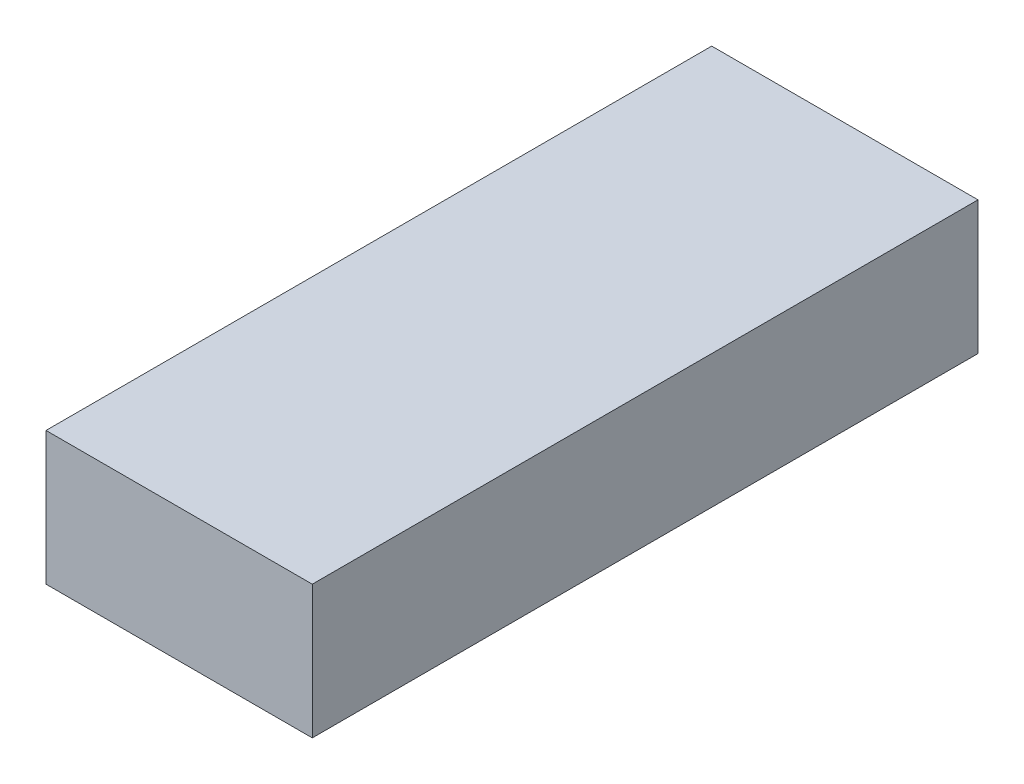
ISO-10303-21;
HEADER;
FILE_DESCRIPTION(('STEP AP214'),'2;1');
FILE_NAME('part.step','',(''),(''),'','','');
FILE_SCHEMA(('AUTOMOTIVE_DESIGN { 1 0 10303 214 1 1 1 1 }'));
ENDSEC;
DATA;
#1=APPLICATION_CONTEXT('core data for automotive mechanical design processes');
#2=APPLICATION_PROTOCOL_DEFINITION('international standard','automotive_design',2000,#1);
#3=PRODUCT_CONTEXT('',#1,'mechanical');
#4=PRODUCT('Part','Part','',(#3));
#5=PRODUCT_RELATED_PRODUCT_CATEGORY('part','',(#4));
#6=PRODUCT_DEFINITION_FORMATION('','',#4);
#7=PRODUCT_DEFINITION_CONTEXT('part definition',#1,'design');
#8=PRODUCT_DEFINITION('design','',#6,#7);
#9=PRODUCT_DEFINITION_SHAPE('','',#8);
#10=(LENGTH_UNIT() NAMED_UNIT(*) SI_UNIT(.MILLI.,.METRE.));
#11=(NAMED_UNIT(*) PLANE_ANGLE_UNIT() SI_UNIT($,.RADIAN.));
#12=(NAMED_UNIT(*) SI_UNIT($,.STERADIAN.) SOLID_ANGLE_UNIT());
#13=UNCERTAINTY_MEASURE_WITH_UNIT(LENGTH_MEASURE(1.E-05),#10,'distance_accuracy_value','');
#14=(GEOMETRIC_REPRESENTATION_CONTEXT(3) GLOBAL_UNCERTAINTY_ASSIGNED_CONTEXT((#13)) GLOBAL_UNIT_ASSIGNED_CONTEXT((#10,
#11,#12)) REPRESENTATION_CONTEXT('',''));
#15=CARTESIAN_POINT('',(0.,0.,0.));
#16=DIRECTION('',(0.,0.,1.));
#17=DIRECTION('',(1.,0.,0.));
#18=AXIS2_PLACEMENT_3D('',#15,#16,#17);
#19=CARTESIAN_POINT('',(0.,10.,0.));
#20=DIRECTION('',(1.,0.,0.));
#21=DIRECTION('',(0.,0.,-1.));
#22=AXIS2_PLACEMENT_3D('',#19,#20,#21);
#23=PLANE('',#22);
#24=DIRECTION('',(0.,0.,1.));
#25=VECTOR('',#24,1.);
#26=CARTESIAN_POINT('',(0.,0.,0.));
#27=LINE('',#26,#25);
#28=CARTESIAN_POINT('',(0.,0.,-50.));
#29=VERTEX_POINT('',#28);
#30=CARTESIAN_POINT('',(0.,0.,0.));
#31=VERTEX_POINT('',#30);
#32=EDGE_CURVE('E99',#29,#31,#27,.T.);
#33=ORIENTED_EDGE('',*,*,#32,.T.);
#34=DIRECTION('',(0.,-1.,0.));
#35=VECTOR('',#34,1.);
#36=CARTESIAN_POINT('',(0.,10.,0.));
#37=LINE('',#36,#35);
#38=CARTESIAN_POINT('',(0.,10.,0.));
#39=VERTEX_POINT('',#38);
#40=EDGE_CURVE('E11',#39,#31,#37,.T.);
#41=ORIENTED_EDGE('',*,*,#40,.F.);
#42=DIRECTION('',(0.,0.,1.));
#43=VECTOR('',#42,1.);
#44=CARTESIAN_POINT('',(0.,10.,0.));
#45=LINE('',#44,#43);
#46=CARTESIAN_POINT('',(0.,10.,-50.));
#47=VERTEX_POINT('',#46);
#48=EDGE_CURVE('E87',#47,#39,#45,.T.);
#49=ORIENTED_EDGE('',*,*,#48,.F.);
#50=DIRECTION('',(0.,-1.,0.));
#51=VECTOR('',#50,1.);
#52=CARTESIAN_POINT('',(0.,10.,-50.));
#53=LINE('',#52,#51);
#54=EDGE_CURVE('E95',#47,#29,#53,.T.);
#55=ORIENTED_EDGE('',*,*,#54,.T.);
#56=EDGE_LOOP('',(#33,#41,#49,#55));
#57=FACE_BOUND('',#56,.T.);
#58=ADVANCED_FACE('F36',(#57),#23,.F.);
#59=CARTESIAN_POINT('',(0.,10.,0.));
#60=DIRECTION('',(0.,0.,-1.));
#61=DIRECTION('',(-1.,0.,0.));
#62=AXIS2_PLACEMENT_3D('',#59,#60,#61);
#63=PLANE('',#62);
#64=DIRECTION('',(1.,0.,0.));
#65=VECTOR('',#64,1.);
#66=CARTESIAN_POINT('',(0.,0.,0.));
#67=LINE('',#66,#65);
#68=CARTESIAN_POINT('',(20.,0.,0.));
#69=VERTEX_POINT('',#68);
#70=EDGE_CURVE('E91',#31,#69,#67,.T.);
#71=ORIENTED_EDGE('',*,*,#70,.T.);
#72=DIRECTION('',(0.,-1.,0.));
#73=VECTOR('',#72,1.);
#74=CARTESIAN_POINT('',(20.,10.,0.));
#75=LINE('',#74,#73);
#76=CARTESIAN_POINT('',(20.,10.,0.));
#77=VERTEX_POINT('',#76);
#78=EDGE_CURVE('E44',#77,#69,#75,.T.);
#79=ORIENTED_EDGE('',*,*,#78,.F.);
#80=DIRECTION('',(1.,0.,0.));
#81=VECTOR('',#80,1.);
#82=CARTESIAN_POINT('',(0.,10.,0.));
#83=LINE('',#82,#81);
#84=EDGE_CURVE('E82',#39,#77,#83,.T.);
#85=ORIENTED_EDGE('',*,*,#84,.F.);
#86=ORIENTED_EDGE('',*,*,#40,.T.);
#87=EDGE_LOOP('',(#71,#79,#85,#86));
#88=FACE_BOUND('',#87,.T.);
#89=ADVANCED_FACE('F90',(#88),#63,.F.);
#90=CARTESIAN_POINT('',(20.,10.,0.));
#91=DIRECTION('',(-1.,0.,0.));
#92=DIRECTION('',(0.,0.,1.));
#93=AXIS2_PLACEMENT_3D('',#90,#91,#92);
#94=PLANE('',#93);
#95=DIRECTION('',(0.,0.,-1.));
#96=VECTOR('',#95,1.);
#97=CARTESIAN_POINT('',(20.,0.,0.));
#98=LINE('',#97,#96);
#99=CARTESIAN_POINT('',(20.,0.,-50.));
#100=VERTEX_POINT('',#99);
#101=EDGE_CURVE('E69',#69,#100,#98,.T.);
#102=ORIENTED_EDGE('',*,*,#101,.T.);
#103=DIRECTION('',(0.,-1.,0.));
#104=VECTOR('',#103,1.);
#105=CARTESIAN_POINT('',(20.,10.,-50.));
#106=LINE('',#105,#104);
#107=CARTESIAN_POINT('',(20.,10.,-50.));
#108=VERTEX_POINT('',#107);
#109=EDGE_CURVE('E92',#108,#100,#106,.T.);
#110=ORIENTED_EDGE('',*,*,#109,.F.);
#111=DIRECTION('',(0.,0.,-1.));
#112=VECTOR('',#111,1.);
#113=CARTESIAN_POINT('',(20.,10.,0.));
#114=LINE('',#113,#112);
#115=EDGE_CURVE('E85',#77,#108,#114,.T.);
#116=ORIENTED_EDGE('',*,*,#115,.F.);
#117=ORIENTED_EDGE('',*,*,#78,.T.);
#118=EDGE_LOOP('',(#102,#110,#116,#117));
#119=FACE_BOUND('',#118,.T.);
#120=ADVANCED_FACE('F93',(#119),#94,.F.);
#121=CARTESIAN_POINT('',(0.,10.,-50.));
#122=DIRECTION('',(0.,0.,1.));
#123=DIRECTION('',(1.,0.,0.));
#124=AXIS2_PLACEMENT_3D('',#121,#122,#123);
#125=PLANE('',#124);
#126=DIRECTION('',(-1.,0.,0.));
#127=VECTOR('',#126,1.);
#128=CARTESIAN_POINT('',(0.,0.,-50.));
#129=LINE('',#128,#127);
#130=EDGE_CURVE('E75',#100,#29,#129,.T.);
#131=ORIENTED_EDGE('',*,*,#130,.T.);
#132=ORIENTED_EDGE('',*,*,#54,.F.);
#133=DIRECTION('',(-1.,0.,0.));
#134=VECTOR('',#133,1.);
#135=CARTESIAN_POINT('',(0.,10.,-50.));
#136=LINE('',#135,#134);
#137=EDGE_CURVE('E52',#108,#47,#136,.T.);
#138=ORIENTED_EDGE('',*,*,#137,.F.);
#139=ORIENTED_EDGE('',*,*,#109,.T.);
#140=EDGE_LOOP('',(#131,#132,#138,#139));
#141=FACE_BOUND('',#140,.T.);
#142=ADVANCED_FACE('F106',(#141),#125,.F.);
#143=CARTESIAN_POINT('',(0.,10.,0.));
#144=DIRECTION('',(0.,-1.,0.));
#145=DIRECTION('',(0.,0.,-1.));
#146=AXIS2_PLACEMENT_3D('',#143,#144,#145);
#147=PLANE('',#146);
#148=ORIENTED_EDGE('',*,*,#48,.T.);
#149=ORIENTED_EDGE('',*,*,#84,.T.);
#150=ORIENTED_EDGE('',*,*,#115,.T.);
#151=ORIENTED_EDGE('',*,*,#137,.T.);
#152=EDGE_LOOP('',(#148,#149,#150,#151));
#153=FACE_BOUND('',#152,.T.);
#154=ADVANCED_FACE('F83',(#153),#147,.F.);
#155=CARTESIAN_POINT('',(0.,0.,0.));
#156=DIRECTION('',(0.,-1.,0.));
#157=DIRECTION('',(0.,0.,-1.));
#158=AXIS2_PLACEMENT_3D('',#155,#156,#157);
#159=PLANE('',#158);
#160=ORIENTED_EDGE('',*,*,#32,.F.);
#161=ORIENTED_EDGE('',*,*,#130,.F.);
#162=ORIENTED_EDGE('',*,*,#101,.F.);
#163=ORIENTED_EDGE('',*,*,#70,.F.);
#164=EDGE_LOOP('',(#160,#161,#162,#163));
#165=FACE_BOUND('',#164,.T.);
#166=ADVANCED_FACE('F109',(#165),#159,.T.);
#167=CLOSED_SHELL('',(#58,#89,#120,#142,#154,#166));
#168=MANIFOLD_SOLID_BREP('B2',#167);
#169=ADVANCED_BREP_SHAPE_REPRESENTATION('',(#18,#168),#14);
#170=SHAPE_DEFINITION_REPRESENTATION(#9,#169);
ENDSEC;
END-ISO-10303-21;
